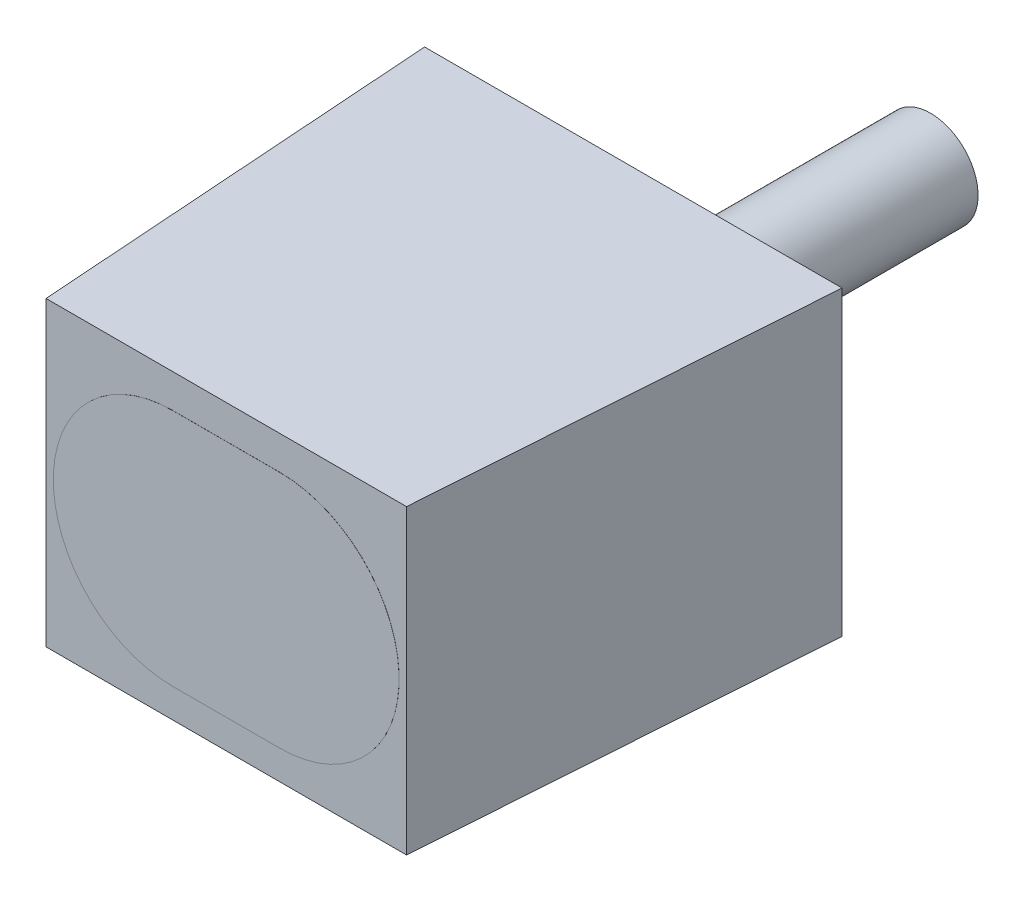
ISO-10303-21;
HEADER;
FILE_DESCRIPTION(('STEP AP214'),'2;1');
FILE_NAME('part.step','',(''),(''),'','','');
FILE_SCHEMA(('AUTOMOTIVE_DESIGN { 1 0 10303 214 1 1 1 1 }'));
ENDSEC;
DATA;
#1=APPLICATION_CONTEXT('core data for automotive mechanical design processes');
#2=APPLICATION_PROTOCOL_DEFINITION('international standard','automotive_design',2000,#1);
#3=PRODUCT_CONTEXT('',#1,'mechanical');
#4=PRODUCT('Part','Part','',(#3));
#5=PRODUCT_RELATED_PRODUCT_CATEGORY('part','',(#4));
#6=PRODUCT_DEFINITION_FORMATION('','',#4);
#7=PRODUCT_DEFINITION_CONTEXT('part definition',#1,'design');
#8=PRODUCT_DEFINITION('design','',#6,#7);
#9=PRODUCT_DEFINITION_SHAPE('','',#8);
#10=(LENGTH_UNIT() NAMED_UNIT(*) SI_UNIT(.MILLI.,.METRE.));
#11=(NAMED_UNIT(*) PLANE_ANGLE_UNIT() SI_UNIT($,.RADIAN.));
#12=(NAMED_UNIT(*) SI_UNIT($,.STERADIAN.) SOLID_ANGLE_UNIT());
#13=UNCERTAINTY_MEASURE_WITH_UNIT(LENGTH_MEASURE(1.E-05),#10,'distance_accuracy_value','');
#14=(GEOMETRIC_REPRESENTATION_CONTEXT(3) GLOBAL_UNCERTAINTY_ASSIGNED_CONTEXT((#13)) GLOBAL_UNIT_ASSIGNED_CONTEXT((#10,
#11,#12)) REPRESENTATION_CONTEXT('',''));
#15=CARTESIAN_POINT('',(0.,0.,0.));
#16=DIRECTION('',(0.,0.,1.));
#17=DIRECTION('',(1.,0.,0.));
#18=AXIS2_PLACEMENT_3D('',#15,#16,#17);
#19=CARTESIAN_POINT('',(22.,31.8,21.45));
#20=DIRECTION('',(0.,0.,1.));
#21=DIRECTION('',(1.,0.,0.));
#22=AXIS2_PLACEMENT_3D('',#19,#20,#21);
#23=PLANE('',#22);
#24=CARTESIAN_POINT('',(5.63424957057381,15.6662627825043,21.45));
#25=DIRECTION('',(0.,0.,1.));
#26=DIRECTION('',(1.,0.,0.));
#27=AXIS2_PLACEMENT_3D('',#24,#25,#26);
#28=CIRCLE('',#27,12.5875859782794);
#29=CARTESIAN_POINT('',(5.63424957057381,3.07867680422495,21.45));
#30=VERTEX_POINT('',#29);
#31=CARTESIAN_POINT('',(5.6342495705738,28.2538487607837,21.45));
#32=VERTEX_POINT('',#31);
#33=EDGE_CURVE('E50',#30,#32,#28,.T.);
#34=ORIENTED_EDGE('',*,*,#33,.F.);
#35=DIRECTION('',(1.,0.,0.));
#36=VECTOR('',#35,1.);
#37=CARTESIAN_POINT('',(5.63424957057381,3.07867680422495,21.45));
#38=LINE('',#37,#36);
#39=CARTESIAN_POINT('',(-5.6342495705738,3.07867680422495,21.45));
#40=VERTEX_POINT('',#39);
#41=EDGE_CURVE('E54',#40,#30,#38,.T.);
#42=ORIENTED_EDGE('',*,*,#41,.F.);
#43=CARTESIAN_POINT('',(-5.63424957057381,15.6662627825043,21.45));
#44=DIRECTION('',(0.,0.,1.));
#45=DIRECTION('',(1.,0.,0.));
#46=AXIS2_PLACEMENT_3D('',#43,#44,#45);
#47=CIRCLE('',#46,12.5875859782794);
#48=CARTESIAN_POINT('',(-5.63424957057381,28.2538487607837,21.45));
#49=VERTEX_POINT('',#48);
#50=EDGE_CURVE('E277',#49,#40,#47,.T.);
#51=ORIENTED_EDGE('',*,*,#50,.F.);
#52=DIRECTION('',(-1.,0.,0.));
#53=VECTOR('',#52,1.);
#54=CARTESIAN_POINT('',(5.6342495705738,28.2538487607837,21.45));
#55=LINE('',#54,#53);
#56=EDGE_CURVE('E283',#32,#49,#55,.T.);
#57=ORIENTED_EDGE('',*,*,#56,.F.);
#58=EDGE_LOOP('',(#34,#42,#51,#57));
#59=FACE_BOUND('',#58,.T.);
#60=DIRECTION('',(-1.,0.,0.));
#61=VECTOR('',#60,1.);
#62=CARTESIAN_POINT('',(22.,0.,21.45));
#63=LINE('',#62,#61);
#64=CARTESIAN_POINT('',(19.,0.,21.45));
#65=VERTEX_POINT('',#64);
#66=CARTESIAN_POINT('',(-19.,0.,21.45));
#67=VERTEX_POINT('',#66);
#68=EDGE_CURVE('E148',#65,#67,#63,.T.);
#69=ORIENTED_EDGE('',*,*,#68,.F.);
#70=DIRECTION('',(0.,1.,0.));
#71=VECTOR('',#70,1.);
#72=CARTESIAN_POINT('',(19.,0.,21.45));
#73=LINE('',#72,#71);
#74=CARTESIAN_POINT('',(19.,31.8,21.45));
#75=VERTEX_POINT('',#74);
#76=EDGE_CURVE('E139',#65,#75,#73,.T.);
#77=ORIENTED_EDGE('',*,*,#76,.T.);
#78=DIRECTION('',(-1.,0.,0.));
#79=VECTOR('',#78,1.);
#80=CARTESIAN_POINT('',(22.,31.8,21.45));
#81=LINE('',#80,#79);
#82=CARTESIAN_POINT('',(-19.,31.8,21.45));
#83=VERTEX_POINT('',#82);
#84=EDGE_CURVE('E147',#75,#83,#81,.T.);
#85=ORIENTED_EDGE('',*,*,#84,.T.);
#86=DIRECTION('',(0.,1.,0.));
#87=VECTOR('',#86,1.);
#88=CARTESIAN_POINT('',(-19.,0.,21.45));
#89=LINE('',#88,#87);
#90=EDGE_CURVE('E134',#67,#83,#89,.T.);
#91=ORIENTED_EDGE('',*,*,#90,.F.);
#92=EDGE_LOOP('',(#69,#77,#85,#91));
#93=FACE_BOUND('',#92,.T.);
#94=ADVANCED_FACE('F34',(#59,#93),#23,.T.);
#95=CARTESIAN_POINT('',(0.,31.8,0.));
#96=DIRECTION('',(0.,1.,0.));
#97=DIRECTION('',(0.,0.,1.));
#98=AXIS2_PLACEMENT_3D('',#95,#96,#97);
#99=PLANE('',#98);
#100=ORIENTED_EDGE('',*,*,#84,.F.);
#101=DIRECTION('',(0.0697597079786605,0.,-0.997563824094846));
#102=VECTOR('',#101,1.);
#103=CARTESIAN_POINT('',(22.,31.8,-21.45));
#104=LINE('',#103,#102);
#105=CARTESIAN_POINT('',(22.,31.8,-21.45));
#106=VERTEX_POINT('',#105);
#107=EDGE_CURVE('E132',#75,#106,#104,.T.);
#108=ORIENTED_EDGE('',*,*,#107,.T.);
#109=DIRECTION('',(-1.,0.,0.));
#110=VECTOR('',#109,1.);
#111=CARTESIAN_POINT('',(22.,31.8,-21.45));
#112=LINE('',#111,#110);
#113=CARTESIAN_POINT('',(-22.,31.8,-21.45));
#114=VERTEX_POINT('',#113);
#115=EDGE_CURVE('E144',#106,#114,#112,.T.);
#116=ORIENTED_EDGE('',*,*,#115,.T.);
#117=DIRECTION('',(0.0697597079786605,0.,0.997563824094846));
#118=VECTOR('',#117,1.);
#119=CARTESIAN_POINT('',(-22.,31.8,-21.45));
#120=LINE('',#119,#118);
#121=EDGE_CURVE('E123',#114,#83,#120,.T.);
#122=ORIENTED_EDGE('',*,*,#121,.T.);
#123=EDGE_LOOP('',(#100,#108,#116,#122));
#124=FACE_BOUND('',#123,.T.);
#125=ADVANCED_FACE('F167',(#124),#99,.T.);
#126=CARTESIAN_POINT('',(0.,0.,0.));
#127=DIRECTION('',(0.,1.,0.));
#128=DIRECTION('',(0.,0.,1.));
#129=AXIS2_PLACEMENT_3D('',#126,#127,#128);
#130=PLANE('',#129);
#131=DIRECTION('',(0.0697597079786605,0.,-0.997563824094846));
#132=VECTOR('',#131,1.);
#133=CARTESIAN_POINT('',(22.,0.,-21.45));
#134=LINE('',#133,#132);
#135=CARTESIAN_POINT('',(22.,0.,-21.45));
#136=VERTEX_POINT('',#135);
#137=EDGE_CURVE('E131',#65,#136,#134,.T.);
#138=ORIENTED_EDGE('',*,*,#137,.F.);
#139=ORIENTED_EDGE('',*,*,#68,.T.);
#140=DIRECTION('',(0.0697597079786605,0.,0.997563824094846));
#141=VECTOR('',#140,1.);
#142=CARTESIAN_POINT('',(-22.,0.,-21.45));
#143=LINE('',#142,#141);
#144=CARTESIAN_POINT('',(-22.,0.,-21.45));
#145=VERTEX_POINT('',#144);
#146=EDGE_CURVE('E129',#145,#67,#143,.T.);
#147=ORIENTED_EDGE('',*,*,#146,.F.);
#148=DIRECTION('',(-1.,0.,0.));
#149=VECTOR('',#148,1.);
#150=CARTESIAN_POINT('',(22.,0.,-21.45));
#151=LINE('',#150,#149);
#152=EDGE_CURVE('E142',#136,#145,#151,.T.);
#153=ORIENTED_EDGE('',*,*,#152,.F.);
#154=EDGE_LOOP('',(#138,#139,#147,#153));
#155=FACE_BOUND('',#154,.T.);
#156=ADVANCED_FACE('F172',(#155),#130,.F.);
#157=CARTESIAN_POINT('',(22.,31.8,-21.45));
#158=DIRECTION('',(0.,0.,1.));
#159=DIRECTION('',(1.,0.,0.));
#160=AXIS2_PLACEMENT_3D('',#157,#158,#159);
#161=PLANE('',#160);
#162=CARTESIAN_POINT('',(-0.46747443499184,15.619515339005,-21.45));
#163=DIRECTION('',(0.,0.,-1.));
#164=DIRECTION('',(-1.,0.,0.));
#165=AXIS2_PLACEMENT_3D('',#162,#163,#164);
#166=CIRCLE('',#165,5.);
#167=CARTESIAN_POINT('',(-5.46747443499184,15.619515339005,-21.45));
#168=VERTEX_POINT('',#167);
#169=EDGE_CURVE('E12',#168,#168,#166,.T.);
#170=ORIENTED_EDGE('',*,*,#169,.F.);
#171=EDGE_LOOP('',(#170));
#172=FACE_BOUND('',#171,.T.);
#173=ORIENTED_EDGE('',*,*,#152,.T.);
#174=DIRECTION('',(0.,-1.,0.));
#175=VECTOR('',#174,1.);
#176=CARTESIAN_POINT('',(-22.,31.8,-21.45));
#177=LINE('',#176,#175);
#178=EDGE_CURVE('E151',#114,#145,#177,.T.);
#179=ORIENTED_EDGE('',*,*,#178,.F.);
#180=ORIENTED_EDGE('',*,*,#115,.F.);
#181=DIRECTION('',(0.,-1.,0.));
#182=VECTOR('',#181,1.);
#183=CARTESIAN_POINT('',(22.,31.8,-21.45));
#184=LINE('',#183,#182);
#185=EDGE_CURVE('E38',#106,#136,#184,.T.);
#186=ORIENTED_EDGE('',*,*,#185,.T.);
#187=EDGE_LOOP('',(#173,#179,#180,#186));
#188=FACE_BOUND('',#187,.T.);
#189=ADVANCED_FACE('F36',(#172,#188),#161,.F.);
#190=CARTESIAN_POINT('',(-22.,0.,-21.45));
#191=DIRECTION('',(-0.997563824094846,0.,0.0697597079786605));
#192=DIRECTION('',(0.0697597079786605,0.,0.997563824094846));
#193=AXIS2_PLACEMENT_3D('',#190,#191,#192);
#194=PLANE('',#193);
#195=ORIENTED_EDGE('',*,*,#121,.F.);
#196=ORIENTED_EDGE('',*,*,#178,.T.);
#197=ORIENTED_EDGE('',*,*,#146,.T.);
#198=ORIENTED_EDGE('',*,*,#90,.T.);
#199=EDGE_LOOP('',(#195,#196,#197,#198));
#200=FACE_BOUND('',#199,.T.);
#201=ADVANCED_FACE('F173',(#200),#194,.T.);
#202=CARTESIAN_POINT('',(22.,0.,-21.45));
#203=DIRECTION('',(0.997563824094846,0.,0.0697597079786605));
#204=DIRECTION('',(0.0697597079786605,0.,-0.997563824094846));
#205=AXIS2_PLACEMENT_3D('',#202,#203,#204);
#206=PLANE('',#205);
#207=ORIENTED_EDGE('',*,*,#107,.F.);
#208=ORIENTED_EDGE('',*,*,#76,.F.);
#209=ORIENTED_EDGE('',*,*,#137,.T.);
#210=ORIENTED_EDGE('',*,*,#185,.F.);
#211=EDGE_LOOP('',(#207,#208,#209,#210));
#212=FACE_BOUND('',#211,.T.);
#213=ADVANCED_FACE('F163',(#212),#206,.T.);
#214=CARTESIAN_POINT('',(-0.467474434991845,15.619515339005,-53.25));
#215=DIRECTION('',(0.,0.,1.));
#216=DIRECTION('',(1.,0.,0.));
#217=AXIS2_PLACEMENT_3D('',#214,#215,#216);
#218=CYLINDRICAL_SURFACE('',#217,5.);
#219=CARTESIAN_POINT('',(-0.467474434991845,15.619515339005,-53.25));
#220=DIRECTION('',(0.,0.,-1.));
#221=DIRECTION('',(-1.,0.,0.));
#222=AXIS2_PLACEMENT_3D('',#219,#220,#221);
#223=CIRCLE('',#222,5.);
#224=CARTESIAN_POINT('',(-5.46747443499185,15.619515339005,-53.25));
#225=VERTEX_POINT('',#224);
#226=EDGE_CURVE('E120',#225,#225,#223,.T.);
#227=ORIENTED_EDGE('',*,*,#226,.F.);
#228=EDGE_LOOP('',(#227));
#229=FACE_BOUND('',#228,.T.);
#230=ORIENTED_EDGE('',*,*,#169,.T.);
#231=EDGE_LOOP('',(#230));
#232=FACE_BOUND('',#231,.T.);
#233=ADVANCED_FACE('F180',(#229,#232),#218,.T.);
#234=CARTESIAN_POINT('',(-0.467474434991845,15.619515339005,-53.25));
#235=DIRECTION('',(0.,0.,-1.));
#236=DIRECTION('',(-1.,0.,0.));
#237=AXIS2_PLACEMENT_3D('',#234,#235,#236);
#238=PLANE('',#237);
#239=ORIENTED_EDGE('',*,*,#226,.T.);
#240=EDGE_LOOP('',(#239));
#241=FACE_BOUND('',#240,.T.);
#242=ADVANCED_FACE('F217',(#241),#238,.T.);
#243=CARTESIAN_POINT('',(5.63424957057381,15.6662627825043,21.46));
#244=DIRECTION('',(0.,0.,-1.));
#245=DIRECTION('',(-1.,0.,0.));
#246=AXIS2_PLACEMENT_3D('',#243,#244,#245);
#247=CYLINDRICAL_SURFACE('',#246,12.5875859782794);
#248=ORIENTED_EDGE('',*,*,#33,.T.);
#249=DIRECTION('',(0.,0.,-1.));
#250=VECTOR('',#249,1.);
#251=CARTESIAN_POINT('',(5.6342495705738,28.2538487607837,21.46));
#252=LINE('',#251,#250);
#253=CARTESIAN_POINT('',(5.6342495705738,28.2538487607837,21.46));
#254=VERTEX_POINT('',#253);
#255=EDGE_CURVE('E103',#254,#32,#252,.T.);
#256=ORIENTED_EDGE('',*,*,#255,.F.);
#257=CARTESIAN_POINT('',(5.63424957057381,15.6662627825043,21.46));
#258=DIRECTION('',(0.,0.,1.));
#259=DIRECTION('',(1.,0.,0.));
#260=AXIS2_PLACEMENT_3D('',#257,#258,#259);
#261=CIRCLE('',#260,12.5875859782794);
#262=CARTESIAN_POINT('',(5.63424957057381,3.07867680422495,21.46));
#263=VERTEX_POINT('',#262);
#264=EDGE_CURVE('E109',#263,#254,#261,.T.);
#265=ORIENTED_EDGE('',*,*,#264,.F.);
#266=DIRECTION('',(0.,0.,-1.));
#267=VECTOR('',#266,1.);
#268=CARTESIAN_POINT('',(5.63424957057381,3.07867680422495,21.46));
#269=LINE('',#268,#267);
#270=EDGE_CURVE('E275',#263,#30,#269,.T.);
#271=ORIENTED_EDGE('',*,*,#270,.T.);
#272=EDGE_LOOP('',(#248,#256,#265,#271));
#273=FACE_BOUND('',#272,.T.);
#274=ADVANCED_FACE('F119',(#273),#247,.T.);
#275=CARTESIAN_POINT('',(5.6342495705738,28.2538487607837,21.46));
#276=DIRECTION('',(0.,-1.,0.));
#277=DIRECTION('',(1.,0.,0.));
#278=AXIS2_PLACEMENT_3D('',#275,#276,#277);
#279=PLANE('',#278);
#280=ORIENTED_EDGE('',*,*,#56,.T.);
#281=DIRECTION('',(0.,0.,-1.));
#282=VECTOR('',#281,1.);
#283=CARTESIAN_POINT('',(-5.63424957057381,28.2538487607837,21.46));
#284=LINE('',#283,#282);
#285=CARTESIAN_POINT('',(-5.63424957057381,28.2538487607837,21.46));
#286=VERTEX_POINT('',#285);
#287=EDGE_CURVE('E105',#286,#49,#284,.T.);
#288=ORIENTED_EDGE('',*,*,#287,.F.);
#289=DIRECTION('',(-1.,0.,0.));
#290=VECTOR('',#289,1.);
#291=CARTESIAN_POINT('',(5.6342495705738,28.2538487607837,21.46));
#292=LINE('',#291,#290);
#293=EDGE_CURVE('E98',#254,#286,#292,.T.);
#294=ORIENTED_EDGE('',*,*,#293,.F.);
#295=ORIENTED_EDGE('',*,*,#255,.T.);
#296=EDGE_LOOP('',(#280,#288,#294,#295));
#297=FACE_BOUND('',#296,.T.);
#298=ADVANCED_FACE('F101',(#297),#279,.F.);
#299=CARTESIAN_POINT('',(-5.63424957057381,15.6662627825043,21.46));
#300=DIRECTION('',(0.,0.,-1.));
#301=DIRECTION('',(-1.,0.,0.));
#302=AXIS2_PLACEMENT_3D('',#299,#300,#301);
#303=CYLINDRICAL_SURFACE('',#302,12.5875859782794);
#304=ORIENTED_EDGE('',*,*,#50,.T.);
#305=DIRECTION('',(0.,0.,-1.));
#306=VECTOR('',#305,1.);
#307=CARTESIAN_POINT('',(-5.6342495705738,3.07867680422495,21.46));
#308=LINE('',#307,#306);
#309=CARTESIAN_POINT('',(-5.6342495705738,3.07867680422495,21.46));
#310=VERTEX_POINT('',#309);
#311=EDGE_CURVE('E125',#310,#40,#308,.T.);
#312=ORIENTED_EDGE('',*,*,#311,.F.);
#313=CARTESIAN_POINT('',(-5.63424957057381,15.6662627825043,21.46));
#314=DIRECTION('',(0.,0.,1.));
#315=DIRECTION('',(1.,0.,0.));
#316=AXIS2_PLACEMENT_3D('',#313,#314,#315);
#317=CIRCLE('',#316,12.5875859782794);
#318=EDGE_CURVE('E108',#286,#310,#317,.T.);
#319=ORIENTED_EDGE('',*,*,#318,.F.);
#320=ORIENTED_EDGE('',*,*,#287,.T.);
#321=EDGE_LOOP('',(#304,#312,#319,#320));
#322=FACE_BOUND('',#321,.T.);
#323=ADVANCED_FACE('F240',(#322),#303,.T.);
#324=CARTESIAN_POINT('',(5.63424957057381,3.07867680422495,21.46));
#325=DIRECTION('',(0.,1.,0.));
#326=DIRECTION('',(-1.,0.,0.));
#327=AXIS2_PLACEMENT_3D('',#324,#325,#326);
#328=PLANE('',#327);
#329=ORIENTED_EDGE('',*,*,#41,.T.);
#330=ORIENTED_EDGE('',*,*,#270,.F.);
#331=DIRECTION('',(1.,0.,0.));
#332=VECTOR('',#331,1.);
#333=CARTESIAN_POINT('',(5.63424957057381,3.07867680422495,21.46));
#334=LINE('',#333,#332);
#335=EDGE_CURVE('E114',#310,#263,#334,.T.);
#336=ORIENTED_EDGE('',*,*,#335,.F.);
#337=ORIENTED_EDGE('',*,*,#311,.T.);
#338=EDGE_LOOP('',(#329,#330,#336,#337));
#339=FACE_BOUND('',#338,.T.);
#340=ADVANCED_FACE('F247',(#339),#328,.F.);
#341=CARTESIAN_POINT('',(5.63424957057381,15.6662627825043,21.46));
#342=DIRECTION('',(0.,0.,1.));
#343=DIRECTION('',(1.,0.,0.));
#344=AXIS2_PLACEMENT_3D('',#341,#342,#343);
#345=PLANE('',#344);
#346=ORIENTED_EDGE('',*,*,#264,.T.);
#347=ORIENTED_EDGE('',*,*,#293,.T.);
#348=ORIENTED_EDGE('',*,*,#318,.T.);
#349=ORIENTED_EDGE('',*,*,#335,.T.);
#350=EDGE_LOOP('',(#346,#347,#348,#349));
#351=FACE_BOUND('',#350,.T.);
#352=ADVANCED_FACE('F112',(#351),#345,.T.);
#353=CLOSED_SHELL('',(#94,#125,#156,#189,#201,#213,#233,#242,#274,#298,#323,#340,#352));
#354=MANIFOLD_SOLID_BREP('B2',#353);
#355=ADVANCED_BREP_SHAPE_REPRESENTATION('',(#18,#354),#14);
#356=SHAPE_DEFINITION_REPRESENTATION(#9,#355);
ENDSEC;
END-ISO-10303-21;
